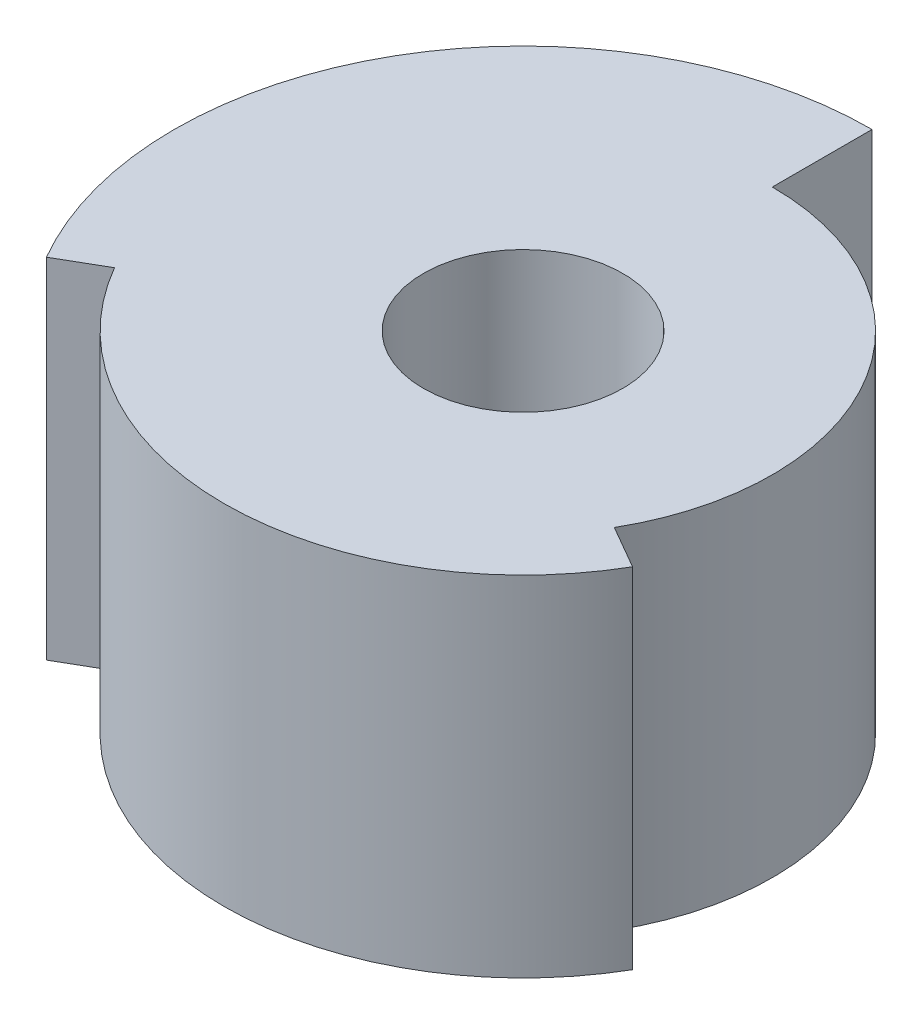
ISO-10303-21;
HEADER;
FILE_DESCRIPTION(('STEP AP214'),'2;1');
FILE_NAME('part.step','',(''),(''),'','','');
FILE_SCHEMA(('AUTOMOTIVE_DESIGN { 1 0 10303 214 1 1 1 1 }'));
ENDSEC;
DATA;
#1=APPLICATION_CONTEXT('core data for automotive mechanical design processes');
#2=APPLICATION_PROTOCOL_DEFINITION('international standard','automotive_design',2000,#1);
#3=PRODUCT_CONTEXT('',#1,'mechanical');
#4=PRODUCT('Part','Part','',(#3));
#5=PRODUCT_RELATED_PRODUCT_CATEGORY('part','',(#4));
#6=PRODUCT_DEFINITION_FORMATION('','',#4);
#7=PRODUCT_DEFINITION_CONTEXT('part definition',#1,'design');
#8=PRODUCT_DEFINITION('design','',#6,#7);
#9=PRODUCT_DEFINITION_SHAPE('','',#8);
#10=(LENGTH_UNIT() NAMED_UNIT(*) SI_UNIT(.MILLI.,.METRE.));
#11=(NAMED_UNIT(*) PLANE_ANGLE_UNIT() SI_UNIT($,.RADIAN.));
#12=(NAMED_UNIT(*) SI_UNIT($,.STERADIAN.) SOLID_ANGLE_UNIT());
#13=UNCERTAINTY_MEASURE_WITH_UNIT(LENGTH_MEASURE(1.E-05),#10,'distance_accuracy_value','');
#14=(GEOMETRIC_REPRESENTATION_CONTEXT(3) GLOBAL_UNCERTAINTY_ASSIGNED_CONTEXT((#13)) GLOBAL_UNIT_ASSIGNED_CONTEXT((#10,
#11,#12)) REPRESENTATION_CONTEXT('',''));
#15=CARTESIAN_POINT('',(0.,0.,0.));
#16=DIRECTION('',(0.,0.,1.));
#17=DIRECTION('',(1.,0.,0.));
#18=AXIS2_PLACEMENT_3D('',#15,#16,#17);
#19=CARTESIAN_POINT('',(0.,35.,0.));
#20=DIRECTION('',(0.,-1.,0.));
#21=DIRECTION('',(0.,0.,-1.));
#22=AXIS2_PLACEMENT_3D('',#19,#20,#21);
#23=PLANE('',#22);
#24=CARTESIAN_POINT('',(0.,35.,0.));
#25=DIRECTION('',(0.,1.,0.));
#26=DIRECTION('',(0.,0.,-1.));
#27=AXIS2_PLACEMENT_3D('',#24,#25,#26);
#28=CIRCLE('',#27,25.);
#29=CARTESIAN_POINT('',(21.6506350946109,35.,12.5000000000001));
#30=VERTEX_POINT('',#29);
#31=CARTESIAN_POINT('',(0.,35.,-25.));
#32=VERTEX_POINT('',#31);
#33=EDGE_CURVE('E155',#30,#32,#28,.T.);
#34=ORIENTED_EDGE('',*,*,#33,.T.);
#35=DIRECTION('',(0.,0.,-1.));
#36=VECTOR('',#35,1.);
#37=CARTESIAN_POINT('',(0.,35.,-25.));
#38=LINE('',#37,#36);
#39=CARTESIAN_POINT('',(0.,35.,-35.));
#40=VERTEX_POINT('',#39);
#41=EDGE_CURVE('E99',#32,#40,#38,.T.);
#42=ORIENTED_EDGE('',*,*,#41,.T.);
#43=CARTESIAN_POINT('',(0.,35.,0.));
#44=DIRECTION('',(0.,1.,0.));
#45=DIRECTION('',(0.,0.,-1.));
#46=AXIS2_PLACEMENT_3D('',#43,#44,#45);
#47=CIRCLE('',#46,35.);
#48=CARTESIAN_POINT('',(-30.3108891324553,35.,17.5000000000001));
#49=VERTEX_POINT('',#48);
#50=EDGE_CURVE('E114',#40,#49,#47,.T.);
#51=ORIENTED_EDGE('',*,*,#50,.T.);
#52=DIRECTION('',(0.866025403784436,0.,-0.500000000000004));
#53=VECTOR('',#52,1.);
#54=CARTESIAN_POINT('',(-25.9807621135331,35.,15.0000000000001));
#55=LINE('',#54,#53);
#56=CARTESIAN_POINT('',(-25.9807621135331,35.,15.0000000000001));
#57=VERTEX_POINT('',#56);
#58=EDGE_CURVE('E110',#49,#57,#55,.T.);
#59=ORIENTED_EDGE('',*,*,#58,.T.);
#60=CARTESIAN_POINT('',(0.,35.,0.));
#61=DIRECTION('',(0.,1.,0.));
#62=DIRECTION('',(0.,0.,-1.));
#63=AXIS2_PLACEMENT_3D('',#60,#61,#62);
#64=CIRCLE('',#63,30.);
#65=CARTESIAN_POINT('',(25.9807621135331,35.,15.0000000000001));
#66=VERTEX_POINT('',#65);
#67=EDGE_CURVE('E112',#57,#66,#64,.T.);
#68=ORIENTED_EDGE('',*,*,#67,.T.);
#69=DIRECTION('',(-0.866025403784436,0.,-0.500000000000004));
#70=VECTOR('',#69,1.);
#71=CARTESIAN_POINT('',(21.6506350946109,35.,12.5000000000001));
#72=LINE('',#71,#70);
#73=EDGE_CURVE('E64',#66,#30,#72,.T.);
#74=ORIENTED_EDGE('',*,*,#73,.T.);
#75=EDGE_LOOP('',(#34,#42,#51,#59,#68,#74));
#76=FACE_BOUND('',#75,.T.);
#77=CARTESIAN_POINT('',(0.,35.,0.));
#78=DIRECTION('',(0.,1.,0.));
#79=DIRECTION('',(0.,0.,1.));
#80=AXIS2_PLACEMENT_3D('',#77,#78,#79);
#81=CIRCLE('',#80,10.);
#82=CARTESIAN_POINT('',(0.,35.,10.));
#83=VERTEX_POINT('',#82);
#84=EDGE_CURVE('E139',#83,#83,#81,.T.);
#85=ORIENTED_EDGE('',*,*,#84,.F.);
#86=EDGE_LOOP('',(#85));
#87=FACE_BOUND('',#86,.T.);
#88=ADVANCED_FACE('F44',(#76,#87),#23,.F.);
#89=CARTESIAN_POINT('',(0.,0.,0.));
#90=DIRECTION('',(0.,-1.,0.));
#91=DIRECTION('',(0.,0.,-1.));
#92=AXIS2_PLACEMENT_3D('',#89,#90,#91);
#93=PLANE('',#92);
#94=CARTESIAN_POINT('',(0.,0.,0.));
#95=DIRECTION('',(0.,1.,0.));
#96=DIRECTION('',(0.,0.,-1.));
#97=AXIS2_PLACEMENT_3D('',#94,#95,#96);
#98=CIRCLE('',#97,25.);
#99=CARTESIAN_POINT('',(21.6506350946109,0.,12.5000000000001));
#100=VERTEX_POINT('',#99);
#101=CARTESIAN_POINT('',(0.,0.,-25.));
#102=VERTEX_POINT('',#101);
#103=EDGE_CURVE('E133',#100,#102,#98,.T.);
#104=ORIENTED_EDGE('',*,*,#103,.F.);
#105=DIRECTION('',(-0.866025403784436,0.,-0.500000000000004));
#106=VECTOR('',#105,1.);
#107=CARTESIAN_POINT('',(21.6506350946109,0.,12.5000000000001));
#108=LINE('',#107,#106);
#109=CARTESIAN_POINT('',(25.9807621135331,0.,15.0000000000001));
#110=VERTEX_POINT('',#109);
#111=EDGE_CURVE('E95',#110,#100,#108,.T.);
#112=ORIENTED_EDGE('',*,*,#111,.F.);
#113=CARTESIAN_POINT('',(0.,0.,0.));
#114=DIRECTION('',(0.,1.,0.));
#115=DIRECTION('',(0.,0.,-1.));
#116=AXIS2_PLACEMENT_3D('',#113,#114,#115);
#117=CIRCLE('',#116,30.);
#118=CARTESIAN_POINT('',(-25.9807621135331,0.,15.0000000000001));
#119=VERTEX_POINT('',#118);
#120=EDGE_CURVE('E88',#119,#110,#117,.T.);
#121=ORIENTED_EDGE('',*,*,#120,.F.);
#122=DIRECTION('',(0.866025403784436,0.,-0.500000000000004));
#123=VECTOR('',#122,1.);
#124=CARTESIAN_POINT('',(-25.9807621135331,0.,15.0000000000001));
#125=LINE('',#124,#123);
#126=CARTESIAN_POINT('',(-30.3108891324553,0.,17.5000000000001));
#127=VERTEX_POINT('',#126);
#128=EDGE_CURVE('E125',#127,#119,#125,.T.);
#129=ORIENTED_EDGE('',*,*,#128,.F.);
#130=CARTESIAN_POINT('',(0.,0.,0.));
#131=DIRECTION('',(0.,1.,0.));
#132=DIRECTION('',(0.,0.,-1.));
#133=AXIS2_PLACEMENT_3D('',#130,#131,#132);
#134=CIRCLE('',#133,35.);
#135=CARTESIAN_POINT('',(0.,0.,-35.));
#136=VERTEX_POINT('',#135);
#137=EDGE_CURVE('E141',#136,#127,#134,.T.);
#138=ORIENTED_EDGE('',*,*,#137,.F.);
#139=DIRECTION('',(0.,0.,-1.));
#140=VECTOR('',#139,1.);
#141=CARTESIAN_POINT('',(0.,0.,-30.));
#142=LINE('',#141,#140);
#143=EDGE_CURVE('E138',#102,#136,#142,.T.);
#144=ORIENTED_EDGE('',*,*,#143,.F.);
#145=EDGE_LOOP('',(#104,#112,#121,#129,#138,#144));
#146=FACE_BOUND('',#145,.T.);
#147=CARTESIAN_POINT('',(0.,0.,0.));
#148=DIRECTION('',(0.,1.,0.));
#149=DIRECTION('',(0.,0.,1.));
#150=AXIS2_PLACEMENT_3D('',#147,#148,#149);
#151=CIRCLE('',#150,10.);
#152=CARTESIAN_POINT('',(0.,0.,10.));
#153=VERTEX_POINT('',#152);
#154=EDGE_CURVE('E252',#153,#153,#151,.T.);
#155=ORIENTED_EDGE('',*,*,#154,.T.);
#156=EDGE_LOOP('',(#155));
#157=FACE_BOUND('',#156,.T.);
#158=ADVANCED_FACE('F164',(#146,#157),#93,.T.);
#159=CARTESIAN_POINT('',(0.,35.,0.));
#160=DIRECTION('',(0.,-1.,0.));
#161=DIRECTION('',(0.,0.,-1.));
#162=AXIS2_PLACEMENT_3D('',#159,#160,#161);
#163=CYLINDRICAL_SURFACE('',#162,25.);
#164=ORIENTED_EDGE('',*,*,#103,.T.);
#165=DIRECTION('',(0.,-1.,0.));
#166=VECTOR('',#165,1.);
#167=CARTESIAN_POINT('',(0.,35.,-25.));
#168=LINE('',#167,#166);
#169=EDGE_CURVE('E11',#32,#102,#168,.T.);
#170=ORIENTED_EDGE('',*,*,#169,.F.);
#171=ORIENTED_EDGE('',*,*,#33,.F.);
#172=DIRECTION('',(0.,-1.,0.));
#173=VECTOR('',#172,1.);
#174=CARTESIAN_POINT('',(21.6506350946109,35.,12.5000000000001));
#175=LINE('',#174,#173);
#176=EDGE_CURVE('E132',#30,#100,#175,.T.);
#177=ORIENTED_EDGE('',*,*,#176,.T.);
#178=EDGE_LOOP('',(#164,#170,#171,#177));
#179=FACE_BOUND('',#178,.T.);
#180=ADVANCED_FACE('F50',(#179),#163,.T.);
#181=CARTESIAN_POINT('',(0.,35.,-30.));
#182=DIRECTION('',(-1.,0.,0.));
#183=DIRECTION('',(0.,0.,1.));
#184=AXIS2_PLACEMENT_3D('',#181,#182,#183);
#185=PLANE('',#184);
#186=ORIENTED_EDGE('',*,*,#143,.T.);
#187=DIRECTION('',(0.,-1.,0.));
#188=VECTOR('',#187,1.);
#189=CARTESIAN_POINT('',(0.,35.,-35.));
#190=LINE('',#189,#188);
#191=EDGE_CURVE('E54',#40,#136,#190,.T.);
#192=ORIENTED_EDGE('',*,*,#191,.F.);
#193=ORIENTED_EDGE('',*,*,#41,.F.);
#194=ORIENTED_EDGE('',*,*,#169,.T.);
#195=EDGE_LOOP('',(#186,#192,#193,#194));
#196=FACE_BOUND('',#195,.T.);
#197=ADVANCED_FACE('F188',(#196),#185,.F.);
#198=CARTESIAN_POINT('',(0.,35.,0.));
#199=DIRECTION('',(0.,-1.,0.));
#200=DIRECTION('',(0.,0.,-1.));
#201=AXIS2_PLACEMENT_3D('',#198,#199,#200);
#202=CYLINDRICAL_SURFACE('',#201,35.);
#203=ORIENTED_EDGE('',*,*,#137,.T.);
#204=DIRECTION('',(0.,-1.,0.));
#205=VECTOR('',#204,1.);
#206=CARTESIAN_POINT('',(-30.3108891324553,35.,17.5000000000001));
#207=LINE('',#206,#205);
#208=EDGE_CURVE('E123',#49,#127,#207,.T.);
#209=ORIENTED_EDGE('',*,*,#208,.F.);
#210=ORIENTED_EDGE('',*,*,#50,.F.);
#211=ORIENTED_EDGE('',*,*,#191,.T.);
#212=EDGE_LOOP('',(#203,#209,#210,#211));
#213=FACE_BOUND('',#212,.T.);
#214=ADVANCED_FACE('F165',(#213),#202,.T.);
#215=CARTESIAN_POINT('',(-25.9807621135331,35.,15.0000000000001));
#216=DIRECTION('',(-0.500000000000004,0.,-0.866025403784436));
#217=DIRECTION('',(-0.866025403784436,0.,0.500000000000004));
#218=AXIS2_PLACEMENT_3D('',#215,#216,#217);
#219=PLANE('',#218);
#220=ORIENTED_EDGE('',*,*,#128,.T.);
#221=DIRECTION('',(0.,-1.,0.));
#222=VECTOR('',#221,1.);
#223=CARTESIAN_POINT('',(-25.9807621135331,35.,15.0000000000001));
#224=LINE('',#223,#222);
#225=EDGE_CURVE('E116',#57,#119,#224,.T.);
#226=ORIENTED_EDGE('',*,*,#225,.F.);
#227=ORIENTED_EDGE('',*,*,#58,.F.);
#228=ORIENTED_EDGE('',*,*,#208,.T.);
#229=EDGE_LOOP('',(#220,#226,#227,#228));
#230=FACE_BOUND('',#229,.T.);
#231=ADVANCED_FACE('F118',(#230),#219,.F.);
#232=CARTESIAN_POINT('',(0.,35.,0.));
#233=DIRECTION('',(0.,-1.,0.));
#234=DIRECTION('',(0.,0.,-1.));
#235=AXIS2_PLACEMENT_3D('',#232,#233,#234);
#236=CYLINDRICAL_SURFACE('',#235,30.);
#237=ORIENTED_EDGE('',*,*,#120,.T.);
#238=DIRECTION('',(0.,-1.,0.));
#239=VECTOR('',#238,1.);
#240=CARTESIAN_POINT('',(25.9807621135331,35.,15.0000000000001));
#241=LINE('',#240,#239);
#242=EDGE_CURVE('E124',#66,#110,#241,.T.);
#243=ORIENTED_EDGE('',*,*,#242,.F.);
#244=ORIENTED_EDGE('',*,*,#67,.F.);
#245=ORIENTED_EDGE('',*,*,#225,.T.);
#246=EDGE_LOOP('',(#237,#243,#244,#245));
#247=FACE_BOUND('',#246,.T.);
#248=ADVANCED_FACE('F130',(#247),#236,.T.);
#249=CARTESIAN_POINT('',(21.6506350946109,35.,12.5000000000001));
#250=DIRECTION('',(-0.500000000000004,0.,0.866025403784436));
#251=DIRECTION('',(0.866025403784436,0.,0.500000000000004));
#252=AXIS2_PLACEMENT_3D('',#249,#250,#251);
#253=PLANE('',#252);
#254=ORIENTED_EDGE('',*,*,#111,.T.);
#255=ORIENTED_EDGE('',*,*,#176,.F.);
#256=ORIENTED_EDGE('',*,*,#73,.F.);
#257=ORIENTED_EDGE('',*,*,#242,.T.);
#258=EDGE_LOOP('',(#254,#255,#256,#257));
#259=FACE_BOUND('',#258,.T.);
#260=ADVANCED_FACE('F168',(#259),#253,.F.);
#261=CARTESIAN_POINT('',(0.,35.,0.));
#262=DIRECTION('',(0.,-1.,0.));
#263=DIRECTION('',(0.,0.,-1.));
#264=AXIS2_PLACEMENT_3D('',#261,#262,#263);
#265=CYLINDRICAL_SURFACE('',#264,10.);
#266=ORIENTED_EDGE('',*,*,#84,.T.);
#267=EDGE_LOOP('',(#266));
#268=FACE_BOUND('',#267,.T.);
#269=ORIENTED_EDGE('',*,*,#154,.F.);
#270=EDGE_LOOP('',(#269));
#271=FACE_BOUND('',#270,.T.);
#272=ADVANCED_FACE('F175',(#268,#271),#265,.F.);
#273=CLOSED_SHELL('',(#88,#158,#180,#197,#214,#231,#248,#260,#272));
#274=MANIFOLD_SOLID_BREP('B2',#273);
#275=ADVANCED_BREP_SHAPE_REPRESENTATION('',(#18,#274),#14);
#276=SHAPE_DEFINITION_REPRESENTATION(#9,#275);
ENDSEC;
END-ISO-10303-21;
